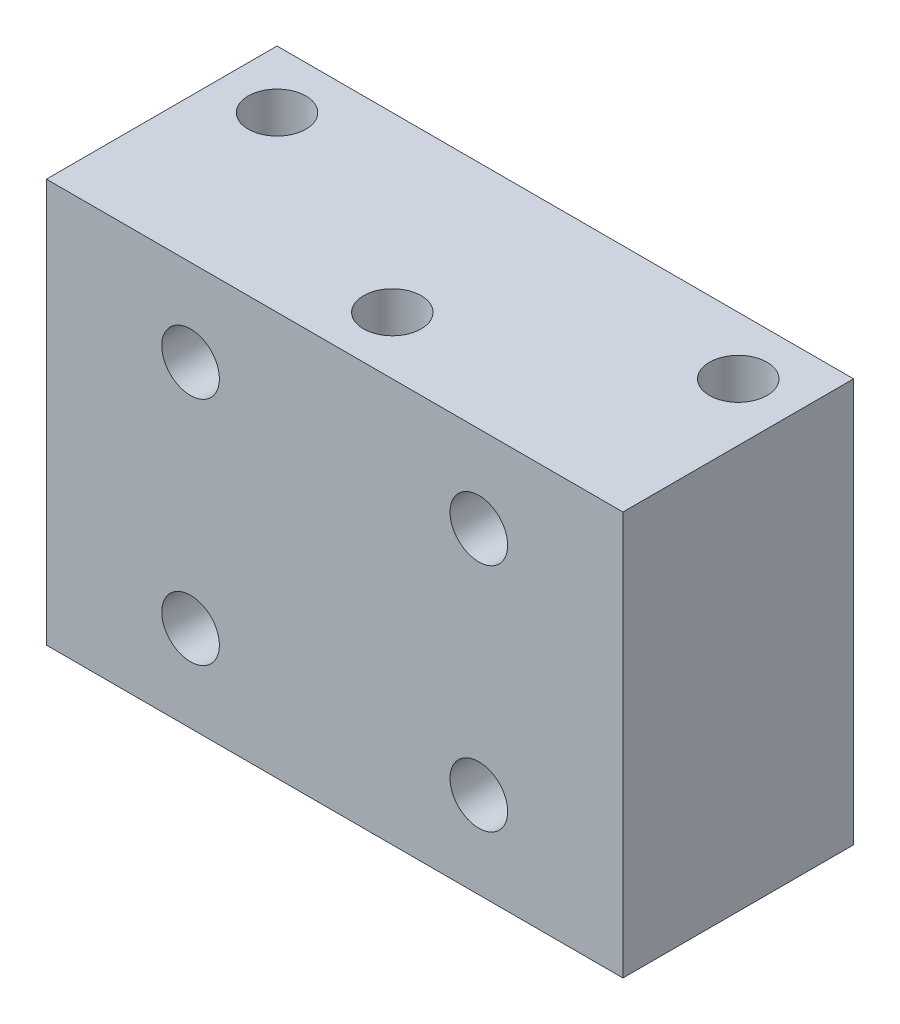
ISO-10303-21;
HEADER;
FILE_DESCRIPTION(('STEP AP214'),'2;1');
FILE_NAME('part.step','',(''),(''),'','','');
FILE_SCHEMA(('AUTOMOTIVE_DESIGN { 1 0 10303 214 1 1 1 1 }'));
ENDSEC;
DATA;
#1=APPLICATION_CONTEXT('core data for automotive mechanical design processes');
#2=APPLICATION_PROTOCOL_DEFINITION('international standard','automotive_design',2000,#1);
#3=PRODUCT_CONTEXT('',#1,'mechanical');
#4=PRODUCT('Part','Part','',(#3));
#5=PRODUCT_RELATED_PRODUCT_CATEGORY('part','',(#4));
#6=PRODUCT_DEFINITION_FORMATION('','',#4);
#7=PRODUCT_DEFINITION_CONTEXT('part definition',#1,'design');
#8=PRODUCT_DEFINITION('design','',#6,#7);
#9=PRODUCT_DEFINITION_SHAPE('','',#8);
#10=(LENGTH_UNIT() NAMED_UNIT(*) SI_UNIT(.MILLI.,.METRE.));
#11=(NAMED_UNIT(*) PLANE_ANGLE_UNIT() SI_UNIT($,.RADIAN.));
#12=(NAMED_UNIT(*) SI_UNIT($,.STERADIAN.) SOLID_ANGLE_UNIT());
#13=UNCERTAINTY_MEASURE_WITH_UNIT(LENGTH_MEASURE(1.E-05),#10,'distance_accuracy_value','');
#14=(GEOMETRIC_REPRESENTATION_CONTEXT(3) GLOBAL_UNCERTAINTY_ASSIGNED_CONTEXT((#13)) GLOBAL_UNIT_ASSIGNED_CONTEXT((#10,
#11,#12)) REPRESENTATION_CONTEXT('',''));
#15=CARTESIAN_POINT('',(0.,0.,0.));
#16=DIRECTION('',(0.,0.,1.));
#17=DIRECTION('',(1.,0.,0.));
#18=AXIS2_PLACEMENT_3D('',#15,#16,#17);
#19=CARTESIAN_POINT('',(127.,-88.9,101.6));
#20=DIRECTION('',(-1.,0.,0.));
#21=DIRECTION('',(0.,0.,1.));
#22=AXIS2_PLACEMENT_3D('',#19,#20,#21);
#23=PLANE('',#22);
#24=DIRECTION('',(0.,1.,0.));
#25=VECTOR('',#24,1.);
#26=CARTESIAN_POINT('',(127.,-88.9,0.));
#27=LINE('',#26,#25);
#28=CARTESIAN_POINT('',(127.,-88.9,0.));
#29=VERTEX_POINT('',#28);
#30=CARTESIAN_POINT('',(127.,88.9,0.));
#31=VERTEX_POINT('',#30);
#32=EDGE_CURVE('E106',#29,#31,#27,.T.);
#33=ORIENTED_EDGE('',*,*,#32,.T.);
#34=DIRECTION('',(0.,0.,-1.));
#35=VECTOR('',#34,1.);
#36=CARTESIAN_POINT('',(127.,88.9,101.6));
#37=LINE('',#36,#35);
#38=CARTESIAN_POINT('',(127.,88.9,101.6));
#39=VERTEX_POINT('',#38);
#40=EDGE_CURVE('E11',#39,#31,#37,.T.);
#41=ORIENTED_EDGE('',*,*,#40,.F.);
#42=DIRECTION('',(0.,1.,0.));
#43=VECTOR('',#42,1.);
#44=CARTESIAN_POINT('',(127.,-88.9,101.6));
#45=LINE('',#44,#43);
#46=CARTESIAN_POINT('',(127.,-88.9,101.6));
#47=VERTEX_POINT('',#46);
#48=EDGE_CURVE('E90',#47,#39,#45,.T.);
#49=ORIENTED_EDGE('',*,*,#48,.F.);
#50=DIRECTION('',(0.,0.,-1.));
#51=VECTOR('',#50,1.);
#52=CARTESIAN_POINT('',(127.,-88.9,101.6));
#53=LINE('',#52,#51);
#54=EDGE_CURVE('E102',#47,#29,#53,.T.);
#55=ORIENTED_EDGE('',*,*,#54,.T.);
#56=EDGE_LOOP('',(#33,#41,#49,#55));
#57=FACE_BOUND('',#56,.T.);
#58=ADVANCED_FACE('F38',(#57),#23,.F.);
#59=CARTESIAN_POINT('',(-127.,88.9,101.6));
#60=DIRECTION('',(0.,-1.,0.));
#61=DIRECTION('',(0.,0.,-1.));
#62=AXIS2_PLACEMENT_3D('',#59,#60,#61);
#63=PLANE('',#62);
#64=CARTESIAN_POINT('',(0.,88.9,76.2));
#65=DIRECTION('',(0.,-1.,0.));
#66=DIRECTION('',(0.,0.,-1.));
#67=AXIS2_PLACEMENT_3D('',#64,#65,#66);
#68=CIRCLE('',#67,12.7);
#69=CARTESIAN_POINT('',(0.,88.9,63.5));
#70=VERTEX_POINT('',#69);
#71=EDGE_CURVE('E167',#70,#70,#68,.T.);
#72=ORIENTED_EDGE('',*,*,#71,.T.);
#73=EDGE_LOOP('',(#72));
#74=FACE_BOUND('',#73,.T.);
#75=CARTESIAN_POINT('',(-101.6,88.9,25.4));
#76=DIRECTION('',(0.,-1.,0.));
#77=DIRECTION('',(0.,0.,-1.));
#78=AXIS2_PLACEMENT_3D('',#75,#76,#77);
#79=CIRCLE('',#78,12.7);
#80=CARTESIAN_POINT('',(-101.6,88.9,12.7));
#81=VERTEX_POINT('',#80);
#82=EDGE_CURVE('E152',#81,#81,#79,.T.);
#83=ORIENTED_EDGE('',*,*,#82,.T.);
#84=EDGE_LOOP('',(#83));
#85=FACE_BOUND('',#84,.T.);
#86=CARTESIAN_POINT('',(101.6,88.9,25.4));
#87=DIRECTION('',(0.,-1.,0.));
#88=DIRECTION('',(0.,0.,-1.));
#89=AXIS2_PLACEMENT_3D('',#86,#87,#88);
#90=CIRCLE('',#89,12.7);
#91=CARTESIAN_POINT('',(101.6,88.9,12.7));
#92=VERTEX_POINT('',#91);
#93=EDGE_CURVE('E143',#92,#92,#90,.T.);
#94=ORIENTED_EDGE('',*,*,#93,.T.);
#95=EDGE_LOOP('',(#94));
#96=FACE_BOUND('',#95,.T.);
#97=DIRECTION('',(-1.,0.,0.));
#98=VECTOR('',#97,1.);
#99=CARTESIAN_POINT('',(-127.,88.9,0.));
#100=LINE('',#99,#98);
#101=CARTESIAN_POINT('',(-127.,88.9,0.));
#102=VERTEX_POINT('',#101);
#103=EDGE_CURVE('E95',#31,#102,#100,.T.);
#104=ORIENTED_EDGE('',*,*,#103,.T.);
#105=DIRECTION('',(0.,0.,-1.));
#106=VECTOR('',#105,1.);
#107=CARTESIAN_POINT('',(-127.,88.9,101.6));
#108=LINE('',#107,#106);
#109=CARTESIAN_POINT('',(-127.,88.9,101.6));
#110=VERTEX_POINT('',#109);
#111=EDGE_CURVE('E47',#110,#102,#108,.T.);
#112=ORIENTED_EDGE('',*,*,#111,.F.);
#113=DIRECTION('',(-1.,0.,0.));
#114=VECTOR('',#113,1.);
#115=CARTESIAN_POINT('',(-127.,88.9,101.6));
#116=LINE('',#115,#114);
#117=EDGE_CURVE('E85',#39,#110,#116,.T.);
#118=ORIENTED_EDGE('',*,*,#117,.F.);
#119=ORIENTED_EDGE('',*,*,#40,.T.);
#120=EDGE_LOOP('',(#104,#112,#118,#119));
#121=FACE_BOUND('',#120,.T.);
#122=ADVANCED_FACE('F94',(#74,#85,#96,#121),#63,.F.);
#123=CARTESIAN_POINT('',(-127.,-88.9,101.6));
#124=DIRECTION('',(1.,0.,0.));
#125=DIRECTION('',(0.,0.,-1.));
#126=AXIS2_PLACEMENT_3D('',#123,#124,#125);
#127=PLANE('',#126);
#128=DIRECTION('',(0.,-1.,0.));
#129=VECTOR('',#128,1.);
#130=CARTESIAN_POINT('',(-127.,-88.9,0.));
#131=LINE('',#130,#129);
#132=CARTESIAN_POINT('',(-127.,-88.9,0.));
#133=VERTEX_POINT('',#132);
#134=EDGE_CURVE('E72',#102,#133,#131,.T.);
#135=ORIENTED_EDGE('',*,*,#134,.T.);
#136=DIRECTION('',(0.,0.,-1.));
#137=VECTOR('',#136,1.);
#138=CARTESIAN_POINT('',(-127.,-88.9,101.6));
#139=LINE('',#138,#137);
#140=CARTESIAN_POINT('',(-127.,-88.9,101.6));
#141=VERTEX_POINT('',#140);
#142=EDGE_CURVE('E97',#141,#133,#139,.T.);
#143=ORIENTED_EDGE('',*,*,#142,.F.);
#144=DIRECTION('',(0.,-1.,0.));
#145=VECTOR('',#144,1.);
#146=CARTESIAN_POINT('',(-127.,-88.9,101.6));
#147=LINE('',#146,#145);
#148=EDGE_CURVE('E88',#110,#141,#147,.T.);
#149=ORIENTED_EDGE('',*,*,#148,.F.);
#150=ORIENTED_EDGE('',*,*,#111,.T.);
#151=EDGE_LOOP('',(#135,#143,#149,#150));
#152=FACE_BOUND('',#151,.T.);
#153=ADVANCED_FACE('F98',(#152),#127,.F.);
#154=CARTESIAN_POINT('',(-127.,-88.9,101.6));
#155=DIRECTION('',(0.,1.,0.));
#156=DIRECTION('',(0.,0.,1.));
#157=AXIS2_PLACEMENT_3D('',#154,#155,#156);
#158=PLANE('',#157);
#159=CARTESIAN_POINT('',(0.,-88.9,76.2));
#160=DIRECTION('',(0.,-1.,0.));
#161=DIRECTION('',(0.,0.,-1.));
#162=AXIS2_PLACEMENT_3D('',#159,#160,#161);
#163=CIRCLE('',#162,12.7);
#164=CARTESIAN_POINT('',(0.,-88.9,63.5));
#165=VERTEX_POINT('',#164);
#166=EDGE_CURVE('E159',#165,#165,#163,.T.);
#167=ORIENTED_EDGE('',*,*,#166,.F.);
#168=EDGE_LOOP('',(#167));
#169=FACE_BOUND('',#168,.T.);
#170=CARTESIAN_POINT('',(-101.6,-88.9,25.4));
#171=DIRECTION('',(0.,-1.,0.));
#172=DIRECTION('',(0.,0.,-1.));
#173=AXIS2_PLACEMENT_3D('',#170,#171,#172);
#174=CIRCLE('',#173,12.7);
#175=CARTESIAN_POINT('',(-101.6,-88.9,12.7));
#176=VERTEX_POINT('',#175);
#177=EDGE_CURVE('E136',#176,#176,#174,.T.);
#178=ORIENTED_EDGE('',*,*,#177,.F.);
#179=EDGE_LOOP('',(#178));
#180=FACE_BOUND('',#179,.T.);
#181=CARTESIAN_POINT('',(101.6,-88.9,25.4));
#182=DIRECTION('',(0.,-1.,0.));
#183=DIRECTION('',(0.,0.,-1.));
#184=AXIS2_PLACEMENT_3D('',#181,#182,#183);
#185=CIRCLE('',#184,12.7);
#186=CARTESIAN_POINT('',(101.6,-88.9,12.7));
#187=VERTEX_POINT('',#186);
#188=EDGE_CURVE('E127',#187,#187,#185,.T.);
#189=ORIENTED_EDGE('',*,*,#188,.F.);
#190=EDGE_LOOP('',(#189));
#191=FACE_BOUND('',#190,.T.);
#192=DIRECTION('',(1.,0.,0.));
#193=VECTOR('',#192,1.);
#194=CARTESIAN_POINT('',(-127.,-88.9,0.));
#195=LINE('',#194,#193);
#196=EDGE_CURVE('E78',#133,#29,#195,.T.);
#197=ORIENTED_EDGE('',*,*,#196,.T.);
#198=ORIENTED_EDGE('',*,*,#54,.F.);
#199=DIRECTION('',(1.,0.,0.));
#200=VECTOR('',#199,1.);
#201=CARTESIAN_POINT('',(-127.,-88.9,101.6));
#202=LINE('',#201,#200);
#203=EDGE_CURVE('E55',#141,#47,#202,.T.);
#204=ORIENTED_EDGE('',*,*,#203,.F.);
#205=ORIENTED_EDGE('',*,*,#142,.T.);
#206=EDGE_LOOP('',(#197,#198,#204,#205));
#207=FACE_BOUND('',#206,.T.);
#208=ADVANCED_FACE('F120',(#169,#180,#191,#207),#158,.F.);
#209=CARTESIAN_POINT('',(0.,0.,101.6));
#210=DIRECTION('',(0.,0.,-1.));
#211=DIRECTION('',(-1.,0.,0.));
#212=AXIS2_PLACEMENT_3D('',#209,#210,#211);
#213=PLANE('',#212);
#214=CARTESIAN_POINT('',(63.5,50.8,101.6));
#215=DIRECTION('',(0.,0.,1.));
#216=DIRECTION('',(1.,0.,0.));
#217=AXIS2_PLACEMENT_3D('',#214,#215,#216);
#218=CIRCLE('',#217,12.7);
#219=CARTESIAN_POINT('',(76.2,50.8,101.6));
#220=VERTEX_POINT('',#219);
#221=EDGE_CURVE('E192',#220,#220,#218,.T.);
#222=ORIENTED_EDGE('',*,*,#221,.F.);
#223=EDGE_LOOP('',(#222));
#224=FACE_BOUND('',#223,.T.);
#225=CARTESIAN_POINT('',(-63.5,-50.8,101.6));
#226=DIRECTION('',(0.,0.,1.));
#227=DIRECTION('',(1.,0.,0.));
#228=AXIS2_PLACEMENT_3D('',#225,#226,#227);
#229=CIRCLE('',#228,12.7);
#230=CARTESIAN_POINT('',(-50.8,-50.8,101.6));
#231=VERTEX_POINT('',#230);
#232=EDGE_CURVE('E183',#231,#231,#229,.T.);
#233=ORIENTED_EDGE('',*,*,#232,.F.);
#234=EDGE_LOOP('',(#233));
#235=FACE_BOUND('',#234,.T.);
#236=CARTESIAN_POINT('',(-63.5,50.8,101.6));
#237=DIRECTION('',(0.,0.,1.));
#238=DIRECTION('',(1.,0.,0.));
#239=AXIS2_PLACEMENT_3D('',#236,#237,#238);
#240=CIRCLE('',#239,12.7);
#241=CARTESIAN_POINT('',(-50.8,50.8,101.6));
#242=VERTEX_POINT('',#241);
#243=EDGE_CURVE('E199',#242,#242,#240,.T.);
#244=ORIENTED_EDGE('',*,*,#243,.F.);
#245=EDGE_LOOP('',(#244));
#246=FACE_BOUND('',#245,.T.);
#247=CARTESIAN_POINT('',(63.5,-50.8,101.6));
#248=DIRECTION('',(0.,0.,1.));
#249=DIRECTION('',(1.,0.,0.));
#250=AXIS2_PLACEMENT_3D('',#247,#248,#249);
#251=CIRCLE('',#250,12.7);
#252=CARTESIAN_POINT('',(76.2,-50.8,101.6));
#253=VERTEX_POINT('',#252);
#254=EDGE_CURVE('E175',#253,#253,#251,.T.);
#255=ORIENTED_EDGE('',*,*,#254,.F.);
#256=EDGE_LOOP('',(#255));
#257=FACE_BOUND('',#256,.T.);
#258=ORIENTED_EDGE('',*,*,#48,.T.);
#259=ORIENTED_EDGE('',*,*,#117,.T.);
#260=ORIENTED_EDGE('',*,*,#148,.T.);
#261=ORIENTED_EDGE('',*,*,#203,.T.);
#262=EDGE_LOOP('',(#258,#259,#260,#261));
#263=FACE_BOUND('',#262,.T.);
#264=ADVANCED_FACE('F86',(#224,#235,#246,#257,#263),#213,.F.);
#265=CARTESIAN_POINT('',(0.,0.,0.));
#266=DIRECTION('',(0.,0.,-1.));
#267=DIRECTION('',(-1.,0.,0.));
#268=AXIS2_PLACEMENT_3D('',#265,#266,#267);
#269=PLANE('',#268);
#270=ORIENTED_EDGE('',*,*,#32,.F.);
#271=ORIENTED_EDGE('',*,*,#196,.F.);
#272=ORIENTED_EDGE('',*,*,#134,.F.);
#273=ORIENTED_EDGE('',*,*,#103,.F.);
#274=EDGE_LOOP('',(#270,#271,#272,#273));
#275=FACE_BOUND('',#274,.T.);
#276=ADVANCED_FACE('F123',(#275),#269,.T.);
#277=CARTESIAN_POINT('',(101.6,-38.1,25.4));
#278=DIRECTION('',(0.,-1.,0.));
#279=DIRECTION('',(0.,0.,-1.));
#280=AXIS2_PLACEMENT_3D('',#277,#278,#279);
#281=CYLINDRICAL_SURFACE('',#280,12.7);
#282=CARTESIAN_POINT('',(101.6,-38.1,25.4));
#283=DIRECTION('',(0.,-1.,0.));
#284=DIRECTION('',(0.,0.,-1.));
#285=AXIS2_PLACEMENT_3D('',#282,#283,#284);
#286=CIRCLE('',#285,12.7);
#287=CARTESIAN_POINT('',(101.6,-38.1,12.7));
#288=VERTEX_POINT('',#287);
#289=EDGE_CURVE('E131',#288,#288,#286,.T.);
#290=ORIENTED_EDGE('',*,*,#289,.F.);
#291=EDGE_LOOP('',(#290));
#292=FACE_BOUND('',#291,.T.);
#293=ORIENTED_EDGE('',*,*,#188,.T.);
#294=EDGE_LOOP('',(#293));
#295=FACE_BOUND('',#294,.T.);
#296=ADVANCED_FACE('F254',(#292,#295),#281,.F.);
#297=CARTESIAN_POINT('',(101.6,-38.1,25.4));
#298=DIRECTION('',(0.,-1.,0.));
#299=DIRECTION('',(0.,0.,-1.));
#300=AXIS2_PLACEMENT_3D('',#297,#298,#299);
#301=PLANE('',#300);
#302=ORIENTED_EDGE('',*,*,#289,.T.);
#303=EDGE_LOOP('',(#302));
#304=FACE_BOUND('',#303,.T.);
#305=ADVANCED_FACE('F258',(#304),#301,.T.);
#306=CARTESIAN_POINT('',(-101.6,-38.1,25.4));
#307=DIRECTION('',(0.,-1.,0.));
#308=DIRECTION('',(0.,0.,-1.));
#309=AXIS2_PLACEMENT_3D('',#306,#307,#308);
#310=CYLINDRICAL_SURFACE('',#309,12.7);
#311=CARTESIAN_POINT('',(-101.6,-38.1,25.4));
#312=DIRECTION('',(0.,-1.,0.));
#313=DIRECTION('',(0.,0.,-1.));
#314=AXIS2_PLACEMENT_3D('',#311,#312,#313);
#315=CIRCLE('',#314,12.7);
#316=CARTESIAN_POINT('',(-101.6,-38.1,12.7));
#317=VERTEX_POINT('',#316);
#318=EDGE_CURVE('E110',#317,#317,#315,.T.);
#319=ORIENTED_EDGE('',*,*,#318,.F.);
#320=EDGE_LOOP('',(#319));
#321=FACE_BOUND('',#320,.T.);
#322=ORIENTED_EDGE('',*,*,#177,.T.);
#323=EDGE_LOOP('',(#322));
#324=FACE_BOUND('',#323,.T.);
#325=ADVANCED_FACE('F262',(#321,#324),#310,.F.);
#326=CARTESIAN_POINT('',(-101.6,-38.1,25.4));
#327=DIRECTION('',(0.,-1.,0.));
#328=DIRECTION('',(0.,0.,-1.));
#329=AXIS2_PLACEMENT_3D('',#326,#327,#328);
#330=PLANE('',#329);
#331=ORIENTED_EDGE('',*,*,#318,.T.);
#332=EDGE_LOOP('',(#331));
#333=FACE_BOUND('',#332,.T.);
#334=ADVANCED_FACE('F266',(#333),#330,.T.);
#335=CARTESIAN_POINT('',(101.6,38.1,25.4));
#336=DIRECTION('',(0.,1.,0.));
#337=DIRECTION('',(0.,0.,1.));
#338=AXIS2_PLACEMENT_3D('',#335,#336,#337);
#339=CYLINDRICAL_SURFACE('',#338,12.7);
#340=CARTESIAN_POINT('',(101.6,38.1,25.4));
#341=DIRECTION('',(0.,-1.,0.));
#342=DIRECTION('',(0.,0.,-1.));
#343=AXIS2_PLACEMENT_3D('',#340,#341,#342);
#344=CIRCLE('',#343,12.7);
#345=CARTESIAN_POINT('',(101.6,38.1,12.7));
#346=VERTEX_POINT('',#345);
#347=EDGE_CURVE('E147',#346,#346,#344,.T.);
#348=ORIENTED_EDGE('',*,*,#347,.T.);
#349=EDGE_LOOP('',(#348));
#350=FACE_BOUND('',#349,.T.);
#351=ORIENTED_EDGE('',*,*,#93,.F.);
#352=EDGE_LOOP('',(#351));
#353=FACE_BOUND('',#352,.T.);
#354=ADVANCED_FACE('F270',(#350,#353),#339,.F.);
#355=CARTESIAN_POINT('',(101.6,38.1,25.4));
#356=DIRECTION('',(0.,1.,0.));
#357=DIRECTION('',(0.,0.,-1.));
#358=AXIS2_PLACEMENT_3D('',#355,#356,#357);
#359=PLANE('',#358);
#360=ORIENTED_EDGE('',*,*,#347,.F.);
#361=EDGE_LOOP('',(#360));
#362=FACE_BOUND('',#361,.T.);
#363=ADVANCED_FACE('F274',(#362),#359,.T.);
#364=CARTESIAN_POINT('',(-101.6,38.1,25.4));
#365=DIRECTION('',(0.,1.,0.));
#366=DIRECTION('',(0.,0.,1.));
#367=AXIS2_PLACEMENT_3D('',#364,#365,#366);
#368=CYLINDRICAL_SURFACE('',#367,12.7);
#369=CARTESIAN_POINT('',(-101.6,38.1,25.4));
#370=DIRECTION('',(0.,-1.,0.));
#371=DIRECTION('',(0.,0.,-1.));
#372=AXIS2_PLACEMENT_3D('',#369,#370,#371);
#373=CIRCLE('',#372,12.7);
#374=CARTESIAN_POINT('',(-101.6,38.1,12.7));
#375=VERTEX_POINT('',#374);
#376=EDGE_CURVE('E132',#375,#375,#373,.T.);
#377=ORIENTED_EDGE('',*,*,#376,.T.);
#378=EDGE_LOOP('',(#377));
#379=FACE_BOUND('',#378,.T.);
#380=ORIENTED_EDGE('',*,*,#82,.F.);
#381=EDGE_LOOP('',(#380));
#382=FACE_BOUND('',#381,.T.);
#383=ADVANCED_FACE('F278',(#379,#382),#368,.F.);
#384=CARTESIAN_POINT('',(-101.6,38.1,25.4));
#385=DIRECTION('',(0.,1.,0.));
#386=DIRECTION('',(0.,0.,-1.));
#387=AXIS2_PLACEMENT_3D('',#384,#385,#386);
#388=PLANE('',#387);
#389=ORIENTED_EDGE('',*,*,#376,.F.);
#390=EDGE_LOOP('',(#389));
#391=FACE_BOUND('',#390,.T.);
#392=ADVANCED_FACE('F282',(#391),#388,.T.);
#393=CARTESIAN_POINT('',(0.,-38.1,76.2));
#394=DIRECTION('',(0.,-1.,0.));
#395=DIRECTION('',(0.,0.,-1.));
#396=AXIS2_PLACEMENT_3D('',#393,#394,#395);
#397=CYLINDRICAL_SURFACE('',#396,12.7);
#398=CARTESIAN_POINT('',(0.,-38.1,76.2));
#399=DIRECTION('',(0.,-1.,0.));
#400=DIRECTION('',(0.,0.,-1.));
#401=AXIS2_PLACEMENT_3D('',#398,#399,#400);
#402=CIRCLE('',#401,12.7);
#403=CARTESIAN_POINT('',(0.,-38.1,63.5));
#404=VERTEX_POINT('',#403);
#405=EDGE_CURVE('E148',#404,#404,#402,.T.);
#406=ORIENTED_EDGE('',*,*,#405,.F.);
#407=EDGE_LOOP('',(#406));
#408=FACE_BOUND('',#407,.T.);
#409=ORIENTED_EDGE('',*,*,#166,.T.);
#410=EDGE_LOOP('',(#409));
#411=FACE_BOUND('',#410,.T.);
#412=ADVANCED_FACE('F286',(#408,#411),#397,.F.);
#413=CARTESIAN_POINT('',(0.,-38.1,76.2));
#414=DIRECTION('',(0.,-1.,0.));
#415=DIRECTION('',(0.,0.,-1.));
#416=AXIS2_PLACEMENT_3D('',#413,#414,#415);
#417=PLANE('',#416);
#418=ORIENTED_EDGE('',*,*,#405,.T.);
#419=EDGE_LOOP('',(#418));
#420=FACE_BOUND('',#419,.T.);
#421=ADVANCED_FACE('F290',(#420),#417,.T.);
#422=CARTESIAN_POINT('',(0.,38.1,76.2));
#423=DIRECTION('',(0.,1.,0.));
#424=DIRECTION('',(0.,0.,1.));
#425=AXIS2_PLACEMENT_3D('',#422,#423,#424);
#426=CYLINDRICAL_SURFACE('',#425,12.7);
#427=CARTESIAN_POINT('',(0.,38.1,76.2));
#428=DIRECTION('',(0.,-1.,0.));
#429=DIRECTION('',(0.,0.,-1.));
#430=AXIS2_PLACEMENT_3D('',#427,#428,#429);
#431=CIRCLE('',#430,12.7);
#432=CARTESIAN_POINT('',(0.,38.1,63.5));
#433=VERTEX_POINT('',#432);
#434=EDGE_CURVE('E163',#433,#433,#431,.T.);
#435=ORIENTED_EDGE('',*,*,#434,.T.);
#436=EDGE_LOOP('',(#435));
#437=FACE_BOUND('',#436,.T.);
#438=ORIENTED_EDGE('',*,*,#71,.F.);
#439=EDGE_LOOP('',(#438));
#440=FACE_BOUND('',#439,.T.);
#441=ADVANCED_FACE('F233',(#437,#440),#426,.F.);
#442=CARTESIAN_POINT('',(0.,38.1,76.2));
#443=DIRECTION('',(0.,1.,0.));
#444=DIRECTION('',(0.,0.,-1.));
#445=AXIS2_PLACEMENT_3D('',#442,#443,#444);
#446=PLANE('',#445);
#447=ORIENTED_EDGE('',*,*,#434,.F.);
#448=EDGE_LOOP('',(#447));
#449=FACE_BOUND('',#448,.T.);
#450=ADVANCED_FACE('F224',(#449),#446,.T.);
#451=CARTESIAN_POINT('',(63.5,-50.8,68.58));
#452=DIRECTION('',(0.,0.,1.));
#453=DIRECTION('',(1.,0.,0.));
#454=AXIS2_PLACEMENT_3D('',#451,#452,#453);
#455=CYLINDRICAL_SURFACE('',#454,12.7);
#456=CARTESIAN_POINT('',(63.5,-50.8,68.58));
#457=DIRECTION('',(0.,0.,1.));
#458=DIRECTION('',(1.,0.,0.));
#459=AXIS2_PLACEMENT_3D('',#456,#457,#458);
#460=CIRCLE('',#459,12.7);
#461=CARTESIAN_POINT('',(76.2,-50.8,68.58));
#462=VERTEX_POINT('',#461);
#463=EDGE_CURVE('E171',#462,#462,#460,.T.);
#464=ORIENTED_EDGE('',*,*,#463,.F.);
#465=EDGE_LOOP('',(#464));
#466=FACE_BOUND('',#465,.T.);
#467=ORIENTED_EDGE('',*,*,#254,.T.);
#468=EDGE_LOOP('',(#467));
#469=FACE_BOUND('',#468,.T.);
#470=ADVANCED_FACE('F222',(#466,#469),#455,.F.);
#471=CARTESIAN_POINT('',(63.5,-50.8,68.58));
#472=DIRECTION('',(0.,0.,1.));
#473=DIRECTION('',(1.,0.,0.));
#474=AXIS2_PLACEMENT_3D('',#471,#472,#473);
#475=PLANE('',#474);
#476=ORIENTED_EDGE('',*,*,#463,.T.);
#477=EDGE_LOOP('',(#476));
#478=FACE_BOUND('',#477,.T.);
#479=ADVANCED_FACE('F212',(#478),#475,.T.);
#480=CARTESIAN_POINT('',(-63.5,50.8,68.58));
#481=DIRECTION('',(0.,0.,1.));
#482=DIRECTION('',(1.,0.,0.));
#483=AXIS2_PLACEMENT_3D('',#480,#481,#482);
#484=CYLINDRICAL_SURFACE('',#483,12.7);
#485=CARTESIAN_POINT('',(-63.5,50.8,68.58));
#486=DIRECTION('',(0.,0.,1.));
#487=DIRECTION('',(1.,0.,0.));
#488=AXIS2_PLACEMENT_3D('',#485,#486,#487);
#489=CIRCLE('',#488,12.7);
#490=CARTESIAN_POINT('',(-50.8,50.8,68.58));
#491=VERTEX_POINT('',#490);
#492=EDGE_CURVE('E188',#491,#491,#489,.T.);
#493=ORIENTED_EDGE('',*,*,#492,.F.);
#494=EDGE_LOOP('',(#493));
#495=FACE_BOUND('',#494,.T.);
#496=ORIENTED_EDGE('',*,*,#243,.T.);
#497=EDGE_LOOP('',(#496));
#498=FACE_BOUND('',#497,.T.);
#499=ADVANCED_FACE('F209',(#495,#498),#484,.F.);
#500=CARTESIAN_POINT('',(-63.5,50.8,68.58));
#501=DIRECTION('',(0.,0.,1.));
#502=DIRECTION('',(1.,0.,0.));
#503=AXIS2_PLACEMENT_3D('',#500,#501,#502);
#504=PLANE('',#503);
#505=ORIENTED_EDGE('',*,*,#492,.T.);
#506=EDGE_LOOP('',(#505));
#507=FACE_BOUND('',#506,.T.);
#508=ADVANCED_FACE('F207',(#507),#504,.T.);
#509=CARTESIAN_POINT('',(-63.5,-50.8,68.58));
#510=DIRECTION('',(0.,0.,1.));
#511=DIRECTION('',(1.,0.,0.));
#512=AXIS2_PLACEMENT_3D('',#509,#510,#511);
#513=CYLINDRICAL_SURFACE('',#512,12.7);
#514=CARTESIAN_POINT('',(-63.5,-50.8,68.58));
#515=DIRECTION('',(0.,0.,1.));
#516=DIRECTION('',(1.,0.,0.));
#517=AXIS2_PLACEMENT_3D('',#514,#515,#516);
#518=CIRCLE('',#517,12.7);
#519=CARTESIAN_POINT('',(-50.8,-50.8,68.58));
#520=VERTEX_POINT('',#519);
#521=EDGE_CURVE('E187',#520,#520,#518,.T.);
#522=ORIENTED_EDGE('',*,*,#521,.F.);
#523=EDGE_LOOP('',(#522));
#524=FACE_BOUND('',#523,.T.);
#525=ORIENTED_EDGE('',*,*,#232,.T.);
#526=EDGE_LOOP('',(#525));
#527=FACE_BOUND('',#526,.T.);
#528=ADVANCED_FACE('F336',(#524,#527),#513,.F.);
#529=CARTESIAN_POINT('',(-63.5,-50.8,68.58));
#530=DIRECTION('',(0.,0.,1.));
#531=DIRECTION('',(1.,0.,0.));
#532=AXIS2_PLACEMENT_3D('',#529,#530,#531);
#533=PLANE('',#532);
#534=ORIENTED_EDGE('',*,*,#521,.T.);
#535=EDGE_LOOP('',(#534));
#536=FACE_BOUND('',#535,.T.);
#537=ADVANCED_FACE('F345',(#536),#533,.T.);
#538=CARTESIAN_POINT('',(63.5,50.8,68.58));
#539=DIRECTION('',(0.,0.,1.));
#540=DIRECTION('',(1.,0.,0.));
#541=AXIS2_PLACEMENT_3D('',#538,#539,#540);
#542=CYLINDRICAL_SURFACE('',#541,12.7);
#543=CARTESIAN_POINT('',(63.5,50.8,68.58));
#544=DIRECTION('',(0.,0.,1.));
#545=DIRECTION('',(1.,0.,0.));
#546=AXIS2_PLACEMENT_3D('',#543,#544,#545);
#547=CIRCLE('',#546,12.7);
#548=CARTESIAN_POINT('',(76.2,50.8,68.58));
#549=VERTEX_POINT('',#548);
#550=EDGE_CURVE('E179',#549,#549,#547,.T.);
#551=ORIENTED_EDGE('',*,*,#550,.F.);
#552=EDGE_LOOP('',(#551));
#553=FACE_BOUND('',#552,.T.);
#554=ORIENTED_EDGE('',*,*,#221,.T.);
#555=EDGE_LOOP('',(#554));
#556=FACE_BOUND('',#555,.T.);
#557=ADVANCED_FACE('F355',(#553,#556),#542,.F.);
#558=CARTESIAN_POINT('',(63.5,50.8,68.58));
#559=DIRECTION('',(0.,0.,1.));
#560=DIRECTION('',(1.,0.,0.));
#561=AXIS2_PLACEMENT_3D('',#558,#559,#560);
#562=PLANE('',#561);
#563=ORIENTED_EDGE('',*,*,#550,.T.);
#564=EDGE_LOOP('',(#563));
#565=FACE_BOUND('',#564,.T.);
#566=ADVANCED_FACE('F365',(#565),#562,.T.);
#567=CLOSED_SHELL('',(#58,#122,#153,#208,#264,#276,#296,#305,#325,#334,#354,#363,#383,#392,#412,
#421,#441,#450,#470,#479,#499,#508,#528,#537,#557,#566));
#568=MANIFOLD_SOLID_BREP('B2',#567);
#569=ADVANCED_BREP_SHAPE_REPRESENTATION('',(#18,#568),#14);
#570=SHAPE_DEFINITION_REPRESENTATION(#9,#569);
ENDSEC;
END-ISO-10303-21;
